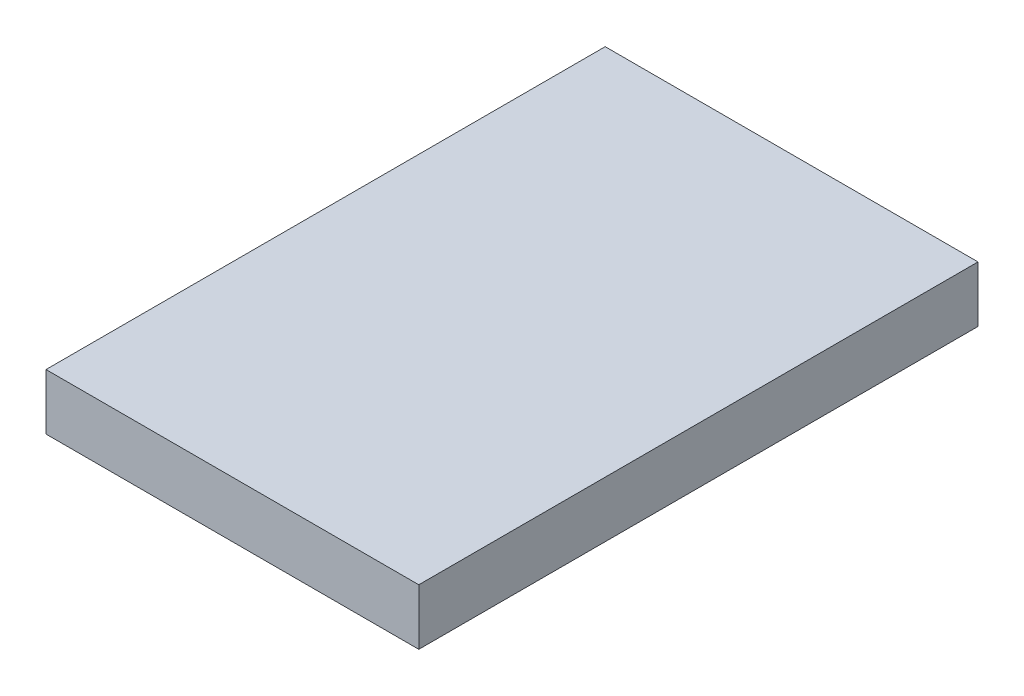
ISO-10303-21;
HEADER;
FILE_DESCRIPTION(('STEP AP214'),'2;1');
FILE_NAME('part.step','',(''),(''),'','','');
FILE_SCHEMA(('AUTOMOTIVE_DESIGN { 1 0 10303 214 1 1 1 1 }'));
ENDSEC;
DATA;
#1=APPLICATION_CONTEXT('core data for automotive mechanical design processes');
#2=APPLICATION_PROTOCOL_DEFINITION('international standard','automotive_design',2000,#1);
#3=PRODUCT_CONTEXT('',#1,'mechanical');
#4=PRODUCT('Part','Part','',(#3));
#5=PRODUCT_RELATED_PRODUCT_CATEGORY('part','',(#4));
#6=PRODUCT_DEFINITION_FORMATION('','',#4);
#7=PRODUCT_DEFINITION_CONTEXT('part definition',#1,'design');
#8=PRODUCT_DEFINITION('design','',#6,#7);
#9=PRODUCT_DEFINITION_SHAPE('','',#8);
#10=(LENGTH_UNIT() NAMED_UNIT(*) SI_UNIT(.MILLI.,.METRE.));
#11=(NAMED_UNIT(*) PLANE_ANGLE_UNIT() SI_UNIT($,.RADIAN.));
#12=(NAMED_UNIT(*) SI_UNIT($,.STERADIAN.) SOLID_ANGLE_UNIT());
#13=UNCERTAINTY_MEASURE_WITH_UNIT(LENGTH_MEASURE(1.E-05),#10,'distance_accuracy_value','');
#14=(GEOMETRIC_REPRESENTATION_CONTEXT(3) GLOBAL_UNCERTAINTY_ASSIGNED_CONTEXT((#13)) GLOBAL_UNIT_ASSIGNED_CONTEXT((#10,
#11,#12)) REPRESENTATION_CONTEXT('',''));
#15=CARTESIAN_POINT('',(0.,0.,0.));
#16=DIRECTION('',(0.,0.,1.));
#17=DIRECTION('',(1.,0.,0.));
#18=AXIS2_PLACEMENT_3D('',#15,#16,#17);
#19=CARTESIAN_POINT('',(-10.4489795918367,3.,-15.0748299319728));
#20=DIRECTION('',(1.,0.,0.));
#21=DIRECTION('',(0.,0.,-1.));
#22=AXIS2_PLACEMENT_3D('',#19,#20,#21);
#23=PLANE('',#22);
#24=DIRECTION('',(0.,0.,1.));
#25=VECTOR('',#24,1.);
#26=CARTESIAN_POINT('',(-10.4489795918367,0.,-15.0748299319728));
#27=LINE('',#26,#25);
#28=CARTESIAN_POINT('',(-10.4489795918367,0.,-15.0748299319728));
#29=VERTEX_POINT('',#28);
#30=CARTESIAN_POINT('',(-10.4489795918367,0.,14.9251700680272));
#31=VERTEX_POINT('',#30);
#32=EDGE_CURVE('E113',#29,#31,#27,.T.);
#33=ORIENTED_EDGE('',*,*,#32,.T.);
#34=DIRECTION('',(0.,-1.,0.));
#35=VECTOR('',#34,1.);
#36=CARTESIAN_POINT('',(-10.4489795918367,3.,14.9251700680272));
#37=LINE('',#36,#35);
#38=CARTESIAN_POINT('',(-10.4489795918367,3.,14.9251700680272));
#39=VERTEX_POINT('',#38);
#40=EDGE_CURVE('E11',#39,#31,#37,.T.);
#41=ORIENTED_EDGE('',*,*,#40,.F.);
#42=DIRECTION('',(0.,0.,1.));
#43=VECTOR('',#42,1.);
#44=CARTESIAN_POINT('',(-10.4489795918367,3.,-15.0748299319728));
#45=LINE('',#44,#43);
#46=CARTESIAN_POINT('',(-10.4489795918367,3.,-15.0748299319728));
#47=VERTEX_POINT('',#46);
#48=EDGE_CURVE('E97',#47,#39,#45,.T.);
#49=ORIENTED_EDGE('',*,*,#48,.F.);
#50=DIRECTION('',(0.,-1.,0.));
#51=VECTOR('',#50,1.);
#52=CARTESIAN_POINT('',(-10.4489795918367,3.,-15.0748299319728));
#53=LINE('',#52,#51);
#54=EDGE_CURVE('E109',#47,#29,#53,.T.);
#55=ORIENTED_EDGE('',*,*,#54,.T.);
#56=EDGE_LOOP('',(#33,#41,#49,#55));
#57=FACE_BOUND('',#56,.T.);
#58=ADVANCED_FACE('F45',(#57),#23,.F.);
#59=CARTESIAN_POINT('',(-10.4489795918367,3.,14.9251700680272));
#60=DIRECTION('',(0.,0.,-1.));
#61=DIRECTION('',(-1.,0.,0.));
#62=AXIS2_PLACEMENT_3D('',#59,#60,#61);
#63=PLANE('',#62);
#64=DIRECTION('',(1.,0.,0.));
#65=VECTOR('',#64,1.);
#66=CARTESIAN_POINT('',(-10.4489795918367,0.,14.9251700680272));
#67=LINE('',#66,#65);
#68=CARTESIAN_POINT('',(9.55102040816326,0.,14.9251700680272));
#69=VERTEX_POINT('',#68);
#70=EDGE_CURVE('E102',#31,#69,#67,.T.);
#71=ORIENTED_EDGE('',*,*,#70,.T.);
#72=DIRECTION('',(0.,-1.,0.));
#73=VECTOR('',#72,1.);
#74=CARTESIAN_POINT('',(9.55102040816326,3.,14.9251700680272));
#75=LINE('',#74,#73);
#76=CARTESIAN_POINT('',(9.55102040816326,3.,14.9251700680272));
#77=VERTEX_POINT('',#76);
#78=EDGE_CURVE('E54',#77,#69,#75,.T.);
#79=ORIENTED_EDGE('',*,*,#78,.F.);
#80=DIRECTION('',(1.,0.,0.));
#81=VECTOR('',#80,1.);
#82=CARTESIAN_POINT('',(-10.4489795918367,3.,14.9251700680272));
#83=LINE('',#82,#81);
#84=EDGE_CURVE('E92',#39,#77,#83,.T.);
#85=ORIENTED_EDGE('',*,*,#84,.F.);
#86=ORIENTED_EDGE('',*,*,#40,.T.);
#87=EDGE_LOOP('',(#71,#79,#85,#86));
#88=FACE_BOUND('',#87,.T.);
#89=ADVANCED_FACE('F101',(#88),#63,.F.);
#90=CARTESIAN_POINT('',(9.55102040816326,3.,-15.0748299319728));
#91=DIRECTION('',(-1.,0.,0.));
#92=DIRECTION('',(0.,0.,1.));
#93=AXIS2_PLACEMENT_3D('',#90,#91,#92);
#94=PLANE('',#93);
#95=DIRECTION('',(0.,0.,-1.));
#96=VECTOR('',#95,1.);
#97=CARTESIAN_POINT('',(9.55102040816326,0.,-15.0748299319728));
#98=LINE('',#97,#96);
#99=CARTESIAN_POINT('',(9.55102040816326,0.,-15.0748299319728));
#100=VERTEX_POINT('',#99);
#101=EDGE_CURVE('E79',#69,#100,#98,.T.);
#102=ORIENTED_EDGE('',*,*,#101,.T.);
#103=DIRECTION('',(0.,-1.,0.));
#104=VECTOR('',#103,1.);
#105=CARTESIAN_POINT('',(9.55102040816326,3.,-15.0748299319728));
#106=LINE('',#105,#104);
#107=CARTESIAN_POINT('',(9.55102040816326,3.,-15.0748299319728));
#108=VERTEX_POINT('',#107);
#109=EDGE_CURVE('E104',#108,#100,#106,.T.);
#110=ORIENTED_EDGE('',*,*,#109,.F.);
#111=DIRECTION('',(0.,0.,-1.));
#112=VECTOR('',#111,1.);
#113=CARTESIAN_POINT('',(9.55102040816326,3.,-15.0748299319728));
#114=LINE('',#113,#112);
#115=EDGE_CURVE('E95',#77,#108,#114,.T.);
#116=ORIENTED_EDGE('',*,*,#115,.F.);
#117=ORIENTED_EDGE('',*,*,#78,.T.);
#118=EDGE_LOOP('',(#102,#110,#116,#117));
#119=FACE_BOUND('',#118,.T.);
#120=ADVANCED_FACE('F105',(#119),#94,.F.);
#121=CARTESIAN_POINT('',(-10.4489795918367,3.,-15.0748299319728));
#122=DIRECTION('',(0.,0.,1.));
#123=DIRECTION('',(1.,0.,0.));
#124=AXIS2_PLACEMENT_3D('',#121,#122,#123);
#125=PLANE('',#124);
#126=DIRECTION('',(-1.,0.,0.));
#127=VECTOR('',#126,1.);
#128=CARTESIAN_POINT('',(-10.4489795918367,0.,-15.0748299319728));
#129=LINE('',#128,#127);
#130=EDGE_CURVE('E85',#100,#29,#129,.T.);
#131=ORIENTED_EDGE('',*,*,#130,.T.);
#132=ORIENTED_EDGE('',*,*,#54,.F.);
#133=DIRECTION('',(-1.,0.,0.));
#134=VECTOR('',#133,1.);
#135=CARTESIAN_POINT('',(-10.4489795918367,3.,-15.0748299319728));
#136=LINE('',#135,#134);
#137=EDGE_CURVE('E62',#108,#47,#136,.T.);
#138=ORIENTED_EDGE('',*,*,#137,.F.);
#139=ORIENTED_EDGE('',*,*,#109,.T.);
#140=EDGE_LOOP('',(#131,#132,#138,#139));
#141=FACE_BOUND('',#140,.T.);
#142=ADVANCED_FACE('F126',(#141),#125,.F.);
#143=CARTESIAN_POINT('',(0.,3.,0.));
#144=DIRECTION('',(0.,1.,0.));
#145=DIRECTION('',(0.,0.,1.));
#146=AXIS2_PLACEMENT_3D('',#143,#144,#145);
#147=PLANE('',#146);
#148=ORIENTED_EDGE('',*,*,#48,.T.);
#149=ORIENTED_EDGE('',*,*,#84,.T.);
#150=ORIENTED_EDGE('',*,*,#115,.T.);
#151=ORIENTED_EDGE('',*,*,#137,.T.);
#152=EDGE_LOOP('',(#148,#149,#150,#151));
#153=FACE_BOUND('',#152,.T.);
#154=ADVANCED_FACE('F93',(#153),#147,.T.);
#155=CARTESIAN_POINT('',(0.,0.,0.));
#156=DIRECTION('',(0.,1.,0.));
#157=DIRECTION('',(0.,0.,1.));
#158=AXIS2_PLACEMENT_3D('',#155,#156,#157);
#159=PLANE('',#158);
#160=ORIENTED_EDGE('',*,*,#32,.F.);
#161=ORIENTED_EDGE('',*,*,#130,.F.);
#162=ORIENTED_EDGE('',*,*,#101,.F.);
#163=ORIENTED_EDGE('',*,*,#70,.F.);
#164=EDGE_LOOP('',(#160,#161,#162,#163));
#165=FACE_BOUND('',#164,.T.);
#166=ADVANCED_FACE('F129',(#165),#159,.F.);
#167=CLOSED_SHELL('',(#58,#89,#120,#142,#154,#166));
#168=MANIFOLD_SOLID_BREP('B2',#167);
#169=ADVANCED_BREP_SHAPE_REPRESENTATION('',(#18,#168),#14);
#170=SHAPE_DEFINITION_REPRESENTATION(#9,#169);
ENDSEC;
END-ISO-10303-21;
